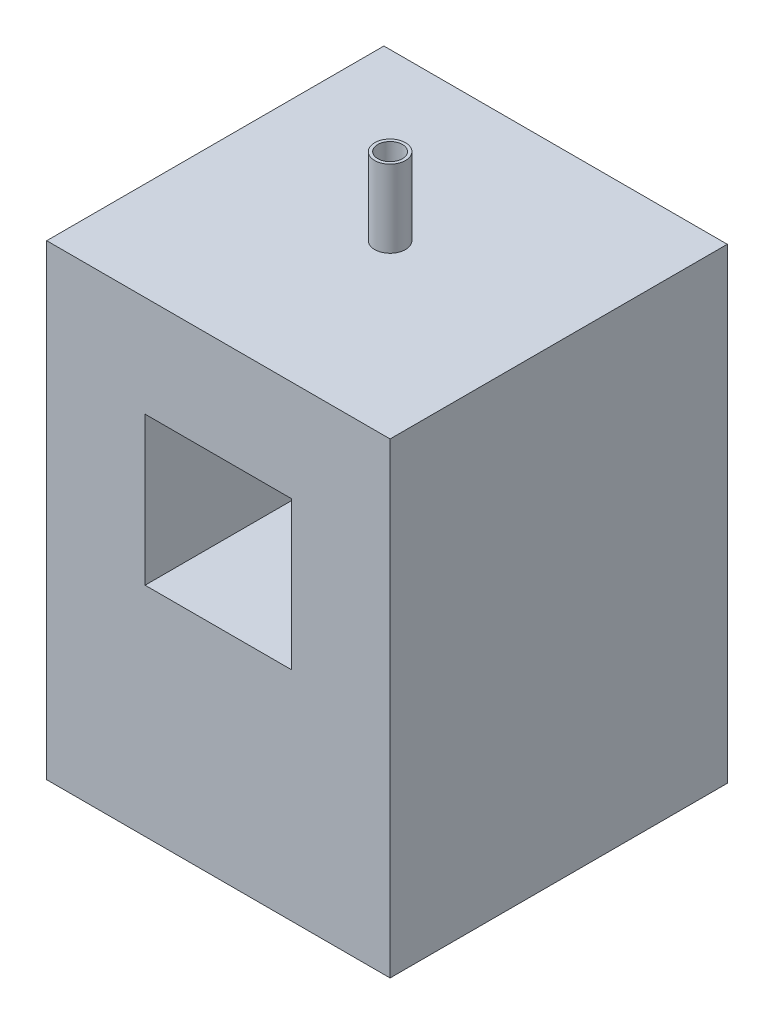
ISO-10303-21;
HEADER;
FILE_DESCRIPTION(('STEP AP214'),'2;1');
FILE_NAME('part.step','',(''),(''),'','','');
FILE_SCHEMA(('AUTOMOTIVE_DESIGN { 1 0 10303 214 1 1 1 1 }'));
ENDSEC;
DATA;
#1=APPLICATION_CONTEXT('core data for automotive mechanical design processes');
#2=APPLICATION_PROTOCOL_DEFINITION('international standard','automotive_design',2000,#1);
#3=PRODUCT_CONTEXT('',#1,'mechanical');
#4=PRODUCT('Part','Part','',(#3));
#5=PRODUCT_RELATED_PRODUCT_CATEGORY('part','',(#4));
#6=PRODUCT_DEFINITION_FORMATION('','',#4);
#7=PRODUCT_DEFINITION_CONTEXT('part definition',#1,'design');
#8=PRODUCT_DEFINITION('design','',#6,#7);
#9=PRODUCT_DEFINITION_SHAPE('','',#8);
#10=(LENGTH_UNIT() NAMED_UNIT(*) SI_UNIT(.MILLI.,.METRE.));
#11=(NAMED_UNIT(*) PLANE_ANGLE_UNIT() SI_UNIT($,.RADIAN.));
#12=(NAMED_UNIT(*) SI_UNIT($,.STERADIAN.) SOLID_ANGLE_UNIT());
#13=UNCERTAINTY_MEASURE_WITH_UNIT(LENGTH_MEASURE(1.E-05),#10,'distance_accuracy_value','');
#14=(GEOMETRIC_REPRESENTATION_CONTEXT(3) GLOBAL_UNCERTAINTY_ASSIGNED_CONTEXT((#13)) GLOBAL_UNIT_ASSIGNED_CONTEXT((#10,
#11,#12)) REPRESENTATION_CONTEXT('',''));
#15=CARTESIAN_POINT('',(0.,0.,0.));
#16=DIRECTION('',(0.,0.,1.));
#17=DIRECTION('',(1.,0.,0.));
#18=AXIS2_PLACEMENT_3D('',#15,#16,#17);
#19=CARTESIAN_POINT('',(-141.2875,192.0875,-277.495));
#20=DIRECTION('',(-1.,0.,0.));
#21=DIRECTION('',(0.,-1.,0.));
#22=AXIS2_PLACEMENT_3D('',#19,#20,#21);
#23=PLANE('',#22);
#24=DIRECTION('',(0.,-1.,0.));
#25=VECTOR('',#24,1.);
#26=CARTESIAN_POINT('',(-141.2875,192.0875,0.));
#27=LINE('',#26,#25);
#28=CARTESIAN_POINT('',(-141.2875,192.0875,0.));
#29=VERTEX_POINT('',#28);
#30=CARTESIAN_POINT('',(-141.2875,-192.0875,0.));
#31=VERTEX_POINT('',#30);
#32=EDGE_CURVE('E140',#29,#31,#27,.T.);
#33=ORIENTED_EDGE('',*,*,#32,.F.);
#34=DIRECTION('',(0.,0.,1.));
#35=VECTOR('',#34,1.);
#36=CARTESIAN_POINT('',(-141.2875,192.0875,-277.495));
#37=LINE('',#36,#35);
#38=CARTESIAN_POINT('',(-141.2875,192.0875,-277.495));
#39=VERTEX_POINT('',#38);
#40=EDGE_CURVE('E11',#39,#29,#37,.T.);
#41=ORIENTED_EDGE('',*,*,#40,.F.);
#42=DIRECTION('',(0.,-1.,0.));
#43=VECTOR('',#42,1.);
#44=CARTESIAN_POINT('',(-141.2875,192.0875,-277.495));
#45=LINE('',#44,#43);
#46=CARTESIAN_POINT('',(-141.2875,-192.0875,-277.495));
#47=VERTEX_POINT('',#46);
#48=EDGE_CURVE('E141',#39,#47,#45,.T.);
#49=ORIENTED_EDGE('',*,*,#48,.T.);
#50=DIRECTION('',(0.,0.,1.));
#51=VECTOR('',#50,1.);
#52=CARTESIAN_POINT('',(-141.2875,-192.0875,-277.495));
#53=LINE('',#52,#51);
#54=EDGE_CURVE('E154',#47,#31,#53,.T.);
#55=ORIENTED_EDGE('',*,*,#54,.T.);
#56=EDGE_LOOP('',(#33,#41,#49,#55));
#57=FACE_BOUND('',#56,.T.);
#58=ADVANCED_FACE('F40',(#57),#23,.T.);
#59=CARTESIAN_POINT('',(141.2875,192.0875,-277.495));
#60=DIRECTION('',(0.,1.,0.));
#61=DIRECTION('',(0.,0.,1.));
#62=AXIS2_PLACEMENT_3D('',#59,#60,#61);
#63=PLANE('',#62);
#64=CARTESIAN_POINT('',(0.,192.0875,-141.2875));
#65=DIRECTION('',(0.,1.,0.));
#66=DIRECTION('',(0.,0.,1.));
#67=AXIS2_PLACEMENT_3D('',#64,#65,#66);
#68=CIRCLE('',#67,12.7);
#69=CARTESIAN_POINT('',(0.,192.0875,-128.5875));
#70=VERTEX_POINT('',#69);
#71=EDGE_CURVE('E358',#70,#70,#68,.T.);
#72=ORIENTED_EDGE('',*,*,#71,.F.);
#73=EDGE_LOOP('',(#72));
#74=FACE_BOUND('',#73,.T.);
#75=DIRECTION('',(-1.,0.,0.));
#76=VECTOR('',#75,1.);
#77=CARTESIAN_POINT('',(141.2875,192.0875,0.));
#78=LINE('',#77,#76);
#79=CARTESIAN_POINT('',(141.2875,192.0875,0.));
#80=VERTEX_POINT('',#79);
#81=EDGE_CURVE('E145',#80,#29,#78,.T.);
#82=ORIENTED_EDGE('',*,*,#81,.F.);
#83=DIRECTION('',(0.,0.,1.));
#84=VECTOR('',#83,1.);
#85=CARTESIAN_POINT('',(141.2875,192.0875,-277.495));
#86=LINE('',#85,#84);
#87=CARTESIAN_POINT('',(141.2875,192.0875,-277.495));
#88=VERTEX_POINT('',#87);
#89=EDGE_CURVE('E48',#88,#80,#86,.T.);
#90=ORIENTED_EDGE('',*,*,#89,.F.);
#91=DIRECTION('',(-1.,0.,0.));
#92=VECTOR('',#91,1.);
#93=CARTESIAN_POINT('',(141.2875,192.0875,-277.495));
#94=LINE('',#93,#92);
#95=EDGE_CURVE('E151',#88,#39,#94,.T.);
#96=ORIENTED_EDGE('',*,*,#95,.T.);
#97=ORIENTED_EDGE('',*,*,#40,.T.);
#98=EDGE_LOOP('',(#82,#90,#96,#97));
#99=FACE_BOUND('',#98,.T.);
#100=ADVANCED_FACE('F177',(#74,#99),#63,.T.);
#101=CARTESIAN_POINT('',(141.2875,192.0875,-277.495));
#102=DIRECTION('',(1.,0.,0.));
#103=DIRECTION('',(0.,1.,0.));
#104=AXIS2_PLACEMENT_3D('',#101,#102,#103);
#105=PLANE('',#104);
#106=DIRECTION('',(0.,1.,0.));
#107=VECTOR('',#106,1.);
#108=CARTESIAN_POINT('',(141.2875,192.0875,0.));
#109=LINE('',#108,#107);
#110=CARTESIAN_POINT('',(141.2875,-192.0875,0.));
#111=VERTEX_POINT('',#110);
#112=EDGE_CURVE('E160',#111,#80,#109,.T.);
#113=ORIENTED_EDGE('',*,*,#112,.F.);
#114=DIRECTION('',(0.,0.,1.));
#115=VECTOR('',#114,1.);
#116=CARTESIAN_POINT('',(141.2875,-192.0875,-277.495));
#117=LINE('',#116,#115);
#118=CARTESIAN_POINT('',(141.2875,-192.0875,-277.495));
#119=VERTEX_POINT('',#118);
#120=EDGE_CURVE('E166',#119,#111,#117,.T.);
#121=ORIENTED_EDGE('',*,*,#120,.F.);
#122=DIRECTION('',(0.,1.,0.));
#123=VECTOR('',#122,1.);
#124=CARTESIAN_POINT('',(141.2875,192.0875,-277.495));
#125=LINE('',#124,#123);
#126=EDGE_CURVE('E148',#119,#88,#125,.T.);
#127=ORIENTED_EDGE('',*,*,#126,.T.);
#128=ORIENTED_EDGE('',*,*,#89,.T.);
#129=EDGE_LOOP('',(#113,#121,#127,#128));
#130=FACE_BOUND('',#129,.T.);
#131=ADVANCED_FACE('F183',(#130),#105,.T.);
#132=CARTESIAN_POINT('',(141.2875,-192.0875,-277.495));
#133=DIRECTION('',(0.,-1.,0.));
#134=DIRECTION('',(1.,0.,0.));
#135=AXIS2_PLACEMENT_3D('',#132,#133,#134);
#136=PLANE('',#135);
#137=DIRECTION('',(1.,0.,0.));
#138=VECTOR('',#137,1.);
#139=CARTESIAN_POINT('',(141.2875,-192.0875,0.));
#140=LINE('',#139,#138);
#141=EDGE_CURVE('E157',#31,#111,#140,.T.);
#142=ORIENTED_EDGE('',*,*,#141,.F.);
#143=ORIENTED_EDGE('',*,*,#54,.F.);
#144=DIRECTION('',(1.,0.,0.));
#145=VECTOR('',#144,1.);
#146=CARTESIAN_POINT('',(141.2875,-192.0875,-277.495));
#147=LINE('',#146,#145);
#148=EDGE_CURVE('E144',#47,#119,#147,.T.);
#149=ORIENTED_EDGE('',*,*,#148,.T.);
#150=ORIENTED_EDGE('',*,*,#120,.T.);
#151=EDGE_LOOP('',(#142,#143,#149,#150));
#152=FACE_BOUND('',#151,.T.);
#153=ADVANCED_FACE('F173',(#152),#136,.T.);
#154=CARTESIAN_POINT('',(0.,0.,-277.495));
#155=DIRECTION('',(0.,0.,-1.));
#156=DIRECTION('',(-1.,0.,0.));
#157=AXIS2_PLACEMENT_3D('',#154,#155,#156);
#158=PLANE('',#157);
#159=DIRECTION('',(0.,1.,0.));
#160=VECTOR('',#159,1.);
#161=CARTESIAN_POINT('',(-60.325,0.,-277.495));
#162=LINE('',#161,#160);
#163=CARTESIAN_POINT('',(-60.325,-12.9704380311858,-277.495));
#164=VERTEX_POINT('',#163);
#165=CARTESIAN_POINT('',(-60.325,108.949561968814,-277.495));
#166=VERTEX_POINT('',#165);
#167=EDGE_CURVE('E138',#164,#166,#162,.T.);
#168=ORIENTED_EDGE('',*,*,#167,.F.);
#169=DIRECTION('',(-1.,0.,0.));
#170=VECTOR('',#169,1.);
#171=CARTESIAN_POINT('',(0.,-12.9704380311858,-277.495));
#172=LINE('',#171,#170);
#173=CARTESIAN_POINT('',(60.325,-12.9704380311857,-277.495));
#174=VERTEX_POINT('',#173);
#175=EDGE_CURVE('E131',#174,#164,#172,.T.);
#176=ORIENTED_EDGE('',*,*,#175,.F.);
#177=DIRECTION('',(0.,-1.,0.));
#178=VECTOR('',#177,1.);
#179=CARTESIAN_POINT('',(60.325,0.,-277.495));
#180=LINE('',#179,#178);
#181=CARTESIAN_POINT('',(60.325,108.949561968814,-277.495));
#182=VERTEX_POINT('',#181);
#183=EDGE_CURVE('E111',#182,#174,#180,.T.);
#184=ORIENTED_EDGE('',*,*,#183,.F.);
#185=DIRECTION('',(1.,0.,0.));
#186=VECTOR('',#185,1.);
#187=CARTESIAN_POINT('',(0.,108.949561968814,-277.495));
#188=LINE('',#187,#186);
#189=EDGE_CURVE('E136',#166,#182,#188,.T.);
#190=ORIENTED_EDGE('',*,*,#189,.F.);
#191=EDGE_LOOP('',(#168,#176,#184,#190));
#192=FACE_BOUND('',#191,.T.);
#193=ORIENTED_EDGE('',*,*,#48,.F.);
#194=ORIENTED_EDGE('',*,*,#95,.F.);
#195=ORIENTED_EDGE('',*,*,#126,.F.);
#196=ORIENTED_EDGE('',*,*,#148,.F.);
#197=EDGE_LOOP('',(#193,#194,#195,#196));
#198=FACE_BOUND('',#197,.T.);
#199=ADVANCED_FACE('F180',(#192,#198),#158,.T.);
#200=CARTESIAN_POINT('',(0.,0.,0.));
#201=DIRECTION('',(0.,0.,-1.));
#202=DIRECTION('',(-1.,0.,0.));
#203=AXIS2_PLACEMENT_3D('',#200,#201,#202);
#204=PLANE('',#203);
#205=DIRECTION('',(1.,0.,0.));
#206=VECTOR('',#205,1.);
#207=CARTESIAN_POINT('',(60.325,-12.9704380311857,0.));
#208=LINE('',#207,#206);
#209=CARTESIAN_POINT('',(-60.325,-12.9704380311858,0.));
#210=VERTEX_POINT('',#209);
#211=CARTESIAN_POINT('',(60.325,-12.9704380311857,0.));
#212=VERTEX_POINT('',#211);
#213=EDGE_CURVE('E117',#210,#212,#208,.T.);
#214=ORIENTED_EDGE('',*,*,#213,.F.);
#215=DIRECTION('',(0.,-1.,0.));
#216=VECTOR('',#215,1.);
#217=CARTESIAN_POINT('',(-60.325,-12.9704380311858,0.));
#218=LINE('',#217,#216);
#219=CARTESIAN_POINT('',(-60.325,108.949561968814,0.));
#220=VERTEX_POINT('',#219);
#221=EDGE_CURVE('E64',#220,#210,#218,.T.);
#222=ORIENTED_EDGE('',*,*,#221,.F.);
#223=DIRECTION('',(-1.,0.,0.));
#224=VECTOR('',#223,1.);
#225=CARTESIAN_POINT('',(60.325,108.949561968814,0.));
#226=LINE('',#225,#224);
#227=CARTESIAN_POINT('',(60.325,108.949561968814,0.));
#228=VERTEX_POINT('',#227);
#229=EDGE_CURVE('E124',#228,#220,#226,.T.);
#230=ORIENTED_EDGE('',*,*,#229,.F.);
#231=DIRECTION('',(0.,1.,0.));
#232=VECTOR('',#231,1.);
#233=CARTESIAN_POINT('',(60.325,-12.9704380311857,0.));
#234=LINE('',#233,#232);
#235=EDGE_CURVE('E108',#212,#228,#234,.T.);
#236=ORIENTED_EDGE('',*,*,#235,.F.);
#237=EDGE_LOOP('',(#214,#222,#230,#236));
#238=FACE_BOUND('',#237,.T.);
#239=ORIENTED_EDGE('',*,*,#32,.T.);
#240=ORIENTED_EDGE('',*,*,#141,.T.);
#241=ORIENTED_EDGE('',*,*,#112,.T.);
#242=ORIENTED_EDGE('',*,*,#81,.T.);
#243=EDGE_LOOP('',(#239,#240,#241,#242));
#244=FACE_BOUND('',#243,.T.);
#245=ADVANCED_FACE('F121',(#238,#244),#204,.F.);
#246=CARTESIAN_POINT('',(-60.325,-12.9704380311858,-282.575));
#247=DIRECTION('',(-1.,0.,0.));
#248=DIRECTION('',(0.,0.,1.));
#249=AXIS2_PLACEMENT_3D('',#246,#247,#248);
#250=PLANE('',#249);
#251=ORIENTED_EDGE('',*,*,#167,.T.);
#252=DIRECTION('',(0.,0.,1.));
#253=VECTOR('',#252,1.);
#254=CARTESIAN_POINT('',(-60.325,108.949561968814,-282.575));
#255=LINE('',#254,#253);
#256=EDGE_CURVE('E129',#166,#220,#255,.T.);
#257=ORIENTED_EDGE('',*,*,#256,.T.);
#258=ORIENTED_EDGE('',*,*,#221,.T.);
#259=DIRECTION('',(0.,0.,1.));
#260=VECTOR('',#259,1.);
#261=CARTESIAN_POINT('',(-60.325,-12.9704380311858,-282.575));
#262=LINE('',#261,#260);
#263=EDGE_CURVE('E114',#164,#210,#262,.T.);
#264=ORIENTED_EDGE('',*,*,#263,.F.);
#265=EDGE_LOOP('',(#251,#257,#258,#264));
#266=FACE_BOUND('',#265,.T.);
#267=ADVANCED_FACE('F210',(#266),#250,.F.);
#268=CARTESIAN_POINT('',(60.325,108.949561968814,-282.575));
#269=DIRECTION('',(0.,1.,0.));
#270=DIRECTION('',(-1.,0.,0.));
#271=AXIS2_PLACEMENT_3D('',#268,#269,#270);
#272=PLANE('',#271);
#273=CARTESIAN_POINT('',(0.,108.949561968814,-141.2875));
#274=DIRECTION('',(0.,1.,0.));
#275=DIRECTION('',(-1.,0.,0.));
#276=AXIS2_PLACEMENT_3D('',#273,#274,#275);
#277=CIRCLE('',#276,5.56658401122774);
#278=CARTESIAN_POINT('',(-5.56658401122774,108.949561968814,-141.2875));
#279=VERTEX_POINT('',#278);
#280=EDGE_CURVE('E43',#279,#279,#277,.T.);
#281=ORIENTED_EDGE('',*,*,#280,.T.);
#282=EDGE_LOOP('',(#281));
#283=FACE_BOUND('',#282,.T.);
#284=ORIENTED_EDGE('',*,*,#189,.T.);
#285=DIRECTION('',(0.,0.,1.));
#286=VECTOR('',#285,1.);
#287=CARTESIAN_POINT('',(60.325,108.949561968814,-282.575));
#288=LINE('',#287,#286);
#289=EDGE_CURVE('E113',#182,#228,#288,.T.);
#290=ORIENTED_EDGE('',*,*,#289,.T.);
#291=ORIENTED_EDGE('',*,*,#229,.T.);
#292=ORIENTED_EDGE('',*,*,#256,.F.);
#293=EDGE_LOOP('',(#284,#290,#291,#292));
#294=FACE_BOUND('',#293,.T.);
#295=ADVANCED_FACE('F222',(#283,#294),#272,.F.);
#296=CARTESIAN_POINT('',(60.325,-12.9704380311857,-282.575));
#297=DIRECTION('',(1.,0.,0.));
#298=DIRECTION('',(0.,1.,0.));
#299=AXIS2_PLACEMENT_3D('',#296,#297,#298);
#300=PLANE('',#299);
#301=ORIENTED_EDGE('',*,*,#183,.T.);
#302=DIRECTION('',(0.,0.,1.));
#303=VECTOR('',#302,1.);
#304=CARTESIAN_POINT('',(60.325,-12.9704380311857,-282.575));
#305=LINE('',#304,#303);
#306=EDGE_CURVE('E56',#174,#212,#305,.T.);
#307=ORIENTED_EDGE('',*,*,#306,.T.);
#308=ORIENTED_EDGE('',*,*,#235,.T.);
#309=ORIENTED_EDGE('',*,*,#289,.F.);
#310=EDGE_LOOP('',(#301,#307,#308,#309));
#311=FACE_BOUND('',#310,.T.);
#312=ADVANCED_FACE('F105',(#311),#300,.F.);
#313=CARTESIAN_POINT('',(60.325,-12.9704380311857,-282.575));
#314=DIRECTION('',(0.,-1.,0.));
#315=DIRECTION('',(1.,0.,0.));
#316=AXIS2_PLACEMENT_3D('',#313,#314,#315);
#317=PLANE('',#316);
#318=ORIENTED_EDGE('',*,*,#175,.T.);
#319=ORIENTED_EDGE('',*,*,#263,.T.);
#320=ORIENTED_EDGE('',*,*,#213,.T.);
#321=ORIENTED_EDGE('',*,*,#306,.F.);
#322=EDGE_LOOP('',(#318,#319,#320,#321));
#323=FACE_BOUND('',#322,.T.);
#324=ADVANCED_FACE('F118',(#323),#317,.F.);
#325=CARTESIAN_POINT('',(0.,255.5875,-141.2875));
#326=DIRECTION('',(0.,-1.,0.));
#327=DIRECTION('',(0.,0.,-1.));
#328=AXIS2_PLACEMENT_3D('',#325,#326,#327);
#329=CYLINDRICAL_SURFACE('',#328,12.7);
#330=CARTESIAN_POINT('',(0.,255.5875,-141.2875));
#331=DIRECTION('',(0.,1.,0.));
#332=DIRECTION('',(0.,0.,1.));
#333=AXIS2_PLACEMENT_3D('',#330,#331,#332);
#334=CIRCLE('',#333,12.7);
#335=CARTESIAN_POINT('',(0.,255.5875,-128.5875));
#336=VERTEX_POINT('',#335);
#337=EDGE_CURVE('E356',#336,#336,#334,.T.);
#338=ORIENTED_EDGE('',*,*,#337,.F.);
#339=EDGE_LOOP('',(#338));
#340=FACE_BOUND('',#339,.T.);
#341=ORIENTED_EDGE('',*,*,#71,.T.);
#342=EDGE_LOOP('',(#341));
#343=FACE_BOUND('',#342,.T.);
#344=ADVANCED_FACE('F233',(#340,#343),#329,.T.);
#345=CARTESIAN_POINT('',(0.,255.5875,-141.2875));
#346=DIRECTION('',(0.,1.,0.));
#347=DIRECTION('',(0.,0.,1.));
#348=AXIS2_PLACEMENT_3D('',#345,#346,#347);
#349=PLANE('',#348);
#350=CARTESIAN_POINT('',(0.,255.5875,-141.2875));
#351=DIRECTION('',(0.,1.,0.));
#352=DIRECTION('',(0.,0.,1.));
#353=AXIS2_PLACEMENT_3D('',#350,#351,#352);
#354=CIRCLE('',#353,10.16);
#355=CARTESIAN_POINT('',(0.,255.5875,-131.1275));
#356=VERTEX_POINT('',#355);
#357=EDGE_CURVE('E364',#356,#356,#354,.T.);
#358=ORIENTED_EDGE('',*,*,#357,.F.);
#359=EDGE_LOOP('',(#358));
#360=FACE_BOUND('',#359,.T.);
#361=ORIENTED_EDGE('',*,*,#337,.T.);
#362=EDGE_LOOP('',(#361));
#363=FACE_BOUND('',#362,.T.);
#364=ADVANCED_FACE('F239',(#360,#363),#349,.T.);
#365=CARTESIAN_POINT('',(0.,204.7875,-141.2875));
#366=DIRECTION('',(0.,1.,0.));
#367=DIRECTION('',(0.,0.,1.));
#368=AXIS2_PLACEMENT_3D('',#365,#366,#367);
#369=CYLINDRICAL_SURFACE('',#368,10.16);
#370=CARTESIAN_POINT('',(0.,204.7875,-141.2875));
#371=DIRECTION('',(0.,1.,0.));
#372=DIRECTION('',(0.,0.,1.));
#373=AXIS2_PLACEMENT_3D('',#370,#371,#372);
#374=CIRCLE('',#373,10.16);
#375=CARTESIAN_POINT('',(0.,204.7875,-131.1275));
#376=VERTEX_POINT('',#375);
#377=EDGE_CURVE('E362',#376,#376,#374,.T.);
#378=ORIENTED_EDGE('',*,*,#377,.F.);
#379=EDGE_LOOP('',(#378));
#380=FACE_BOUND('',#379,.T.);
#381=ORIENTED_EDGE('',*,*,#357,.T.);
#382=EDGE_LOOP('',(#381));
#383=FACE_BOUND('',#382,.T.);
#384=ADVANCED_FACE('F247',(#380,#383),#369,.F.);
#385=CARTESIAN_POINT('',(0.,204.7875,-141.2875));
#386=DIRECTION('',(0.,1.,0.));
#387=DIRECTION('',(0.,0.,1.));
#388=AXIS2_PLACEMENT_3D('',#385,#386,#387);
#389=PLANE('',#388);
#390=CARTESIAN_POINT('',(0.,204.7875,-141.2875));
#391=DIRECTION('',(0.,1.,0.));
#392=DIRECTION('',(0.,0.,1.));
#393=AXIS2_PLACEMENT_3D('',#390,#391,#392);
#394=CIRCLE('',#393,5.56658401122774);
#395=CARTESIAN_POINT('',(0.,204.7875,-135.720915988772));
#396=VERTEX_POINT('',#395);
#397=EDGE_CURVE('E369',#396,#396,#394,.T.);
#398=ORIENTED_EDGE('',*,*,#397,.F.);
#399=EDGE_LOOP('',(#398));
#400=FACE_BOUND('',#399,.T.);
#401=ORIENTED_EDGE('',*,*,#377,.T.);
#402=EDGE_LOOP('',(#401));
#403=FACE_BOUND('',#402,.T.);
#404=ADVANCED_FACE('F255',(#400,#403),#389,.T.);
#405=CARTESIAN_POINT('',(0.,105.9815,-141.2875));
#406=DIRECTION('',(0.,1.,0.));
#407=DIRECTION('',(0.,0.,1.));
#408=AXIS2_PLACEMENT_3D('',#405,#406,#407);
#409=CYLINDRICAL_SURFACE('',#408,5.56658401122774);
#410=ORIENTED_EDGE('',*,*,#397,.T.);
#411=EDGE_LOOP('',(#410));
#412=FACE_BOUND('',#411,.T.);
#413=ORIENTED_EDGE('',*,*,#280,.F.);
#414=EDGE_LOOP('',(#413));
#415=FACE_BOUND('',#414,.T.);
#416=ADVANCED_FACE('F263',(#412,#415),#409,.F.);
#417=CLOSED_SHELL('',(#58,#100,#131,#153,#199,#245,#267,#295,#312,#324,#344,#364,#384,#404,#416));
#418=MANIFOLD_SOLID_BREP('B2',#417);
#419=ADVANCED_BREP_SHAPE_REPRESENTATION('',(#18,#418),#14);
#420=SHAPE_DEFINITION_REPRESENTATION(#9,#419);
ENDSEC;
END-ISO-10303-21;
